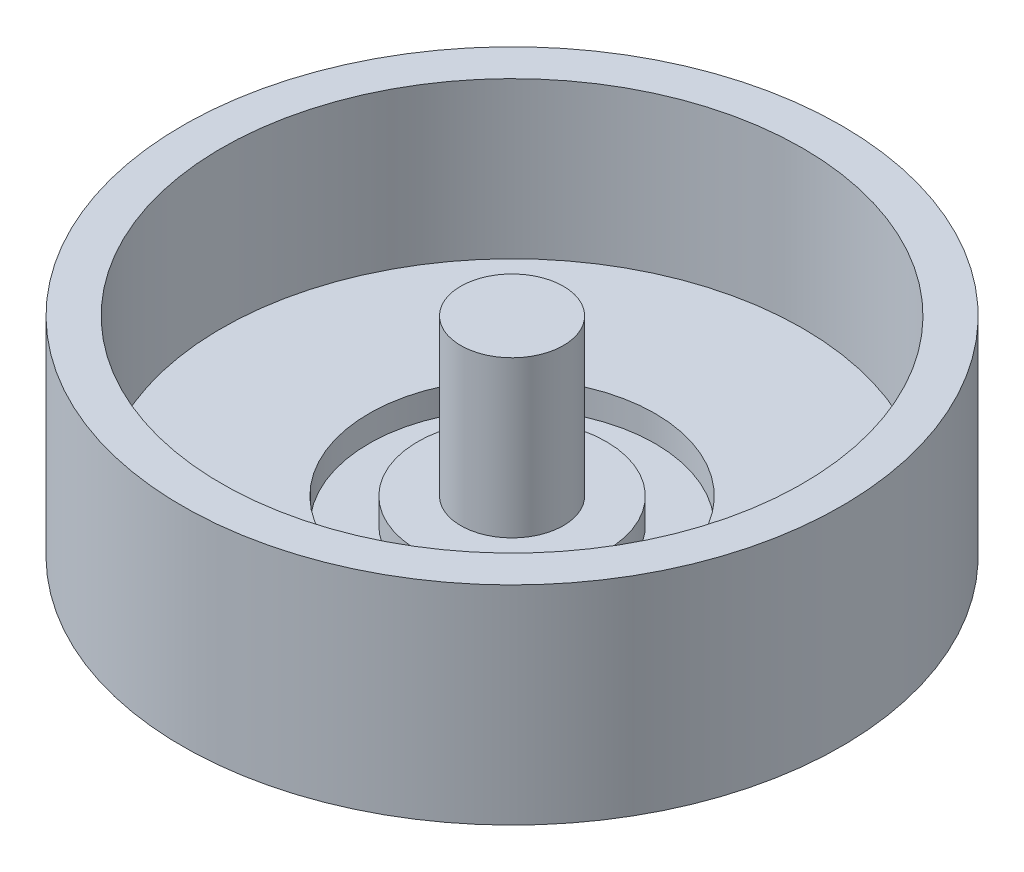
ISO-10303-21;
HEADER;
FILE_DESCRIPTION(('STEP AP214'),'2;1');
FILE_NAME('part.step','',(''),(''),'','','');
FILE_SCHEMA(('AUTOMOTIVE_DESIGN { 1 0 10303 214 1 1 1 1 }'));
ENDSEC;
DATA;
#1=APPLICATION_CONTEXT('core data for automotive mechanical design processes');
#2=APPLICATION_PROTOCOL_DEFINITION('international standard','automotive_design',2000,#1);
#3=PRODUCT_CONTEXT('',#1,'mechanical');
#4=PRODUCT('Part','Part','',(#3));
#5=PRODUCT_RELATED_PRODUCT_CATEGORY('part','',(#4));
#6=PRODUCT_DEFINITION_FORMATION('','',#4);
#7=PRODUCT_DEFINITION_CONTEXT('part definition',#1,'design');
#8=PRODUCT_DEFINITION('design','',#6,#7);
#9=PRODUCT_DEFINITION_SHAPE('','',#8);
#10=(LENGTH_UNIT() NAMED_UNIT(*) SI_UNIT(.MILLI.,.METRE.));
#11=(NAMED_UNIT(*) PLANE_ANGLE_UNIT() SI_UNIT($,.RADIAN.));
#12=(NAMED_UNIT(*) SI_UNIT($,.STERADIAN.) SOLID_ANGLE_UNIT());
#13=UNCERTAINTY_MEASURE_WITH_UNIT(LENGTH_MEASURE(1.E-05),#10,'distance_accuracy_value','');
#14=(GEOMETRIC_REPRESENTATION_CONTEXT(3) GLOBAL_UNCERTAINTY_ASSIGNED_CONTEXT((#13)) GLOBAL_UNIT_ASSIGNED_CONTEXT((#10,
#11,#12)) REPRESENTATION_CONTEXT('',''));
#15=CARTESIAN_POINT('',(0.,0.,0.));
#16=DIRECTION('',(0.,0.,1.));
#17=DIRECTION('',(1.,0.,0.));
#18=AXIS2_PLACEMENT_3D('',#15,#16,#17);
#19=CARTESIAN_POINT('',(0.,0.,-25.35));
#20=DIRECTION('',(0.,-1.,0.));
#21=DIRECTION('',(0.,0.,-1.));
#22=AXIS2_PLACEMENT_3D('',#19,#20,#21);
#23=PLANE('',#22);
#24=CARTESIAN_POINT('',(0.,0.,0.));
#25=DIRECTION('',(0.,-1.,0.));
#26=DIRECTION('',(0.,0.,-1.));
#27=AXIS2_PLACEMENT_3D('',#24,#25,#26);
#28=CIRCLE('',#27,25.35);
#29=CARTESIAN_POINT('',(0.,0.,-25.35));
#30=VERTEX_POINT('',#29);
#31=EDGE_CURVE('E69',#30,#30,#28,.T.);
#32=ORIENTED_EDGE('',*,*,#31,.T.);
#33=EDGE_LOOP('',(#32));
#34=FACE_BOUND('',#33,.T.);
#35=ADVANCED_FACE('F35',(#34),#23,.T.);
#36=CARTESIAN_POINT('',(0.,16.,0.));
#37=DIRECTION('',(0.,1.,0.));
#38=DIRECTION('',(0.,0.,1.));
#39=AXIS2_PLACEMENT_3D('',#36,#37,#38);
#40=PLANE('',#39);
#41=CARTESIAN_POINT('',(0.,16.,0.));
#42=DIRECTION('',(0.,-1.,0.));
#43=DIRECTION('',(0.,0.,-1.));
#44=AXIS2_PLACEMENT_3D('',#41,#42,#43);
#45=CIRCLE('',#44,3.95);
#46=CARTESIAN_POINT('',(0.,16.,-3.95));
#47=VERTEX_POINT('',#46);
#48=EDGE_CURVE('E10',#47,#47,#45,.T.);
#49=ORIENTED_EDGE('',*,*,#48,.F.);
#50=EDGE_LOOP('',(#49));
#51=FACE_BOUND('',#50,.T.);
#52=ADVANCED_FACE('F86',(#51),#40,.T.);
#53=CARTESIAN_POINT('',(0.,0.,0.));
#54=DIRECTION('',(0.,-1.,0.));
#55=DIRECTION('',(0.,0.,-1.));
#56=AXIS2_PLACEMENT_3D('',#53,#54,#55);
#57=CYLINDRICAL_SURFACE('',#56,3.95);
#58=ORIENTED_EDGE('',*,*,#48,.T.);
#59=EDGE_LOOP('',(#58));
#60=FACE_BOUND('',#59,.T.);
#61=CARTESIAN_POINT('',(0.,4.,0.));
#62=DIRECTION('',(0.,-1.,0.));
#63=DIRECTION('',(0.,0.,-1.));
#64=AXIS2_PLACEMENT_3D('',#61,#62,#63);
#65=CIRCLE('',#64,3.95);
#66=CARTESIAN_POINT('',(0.,4.,-3.95));
#67=VERTEX_POINT('',#66);
#68=EDGE_CURVE('E41',#67,#67,#65,.T.);
#69=ORIENTED_EDGE('',*,*,#68,.F.);
#70=EDGE_LOOP('',(#69));
#71=FACE_BOUND('',#70,.T.);
#72=ADVANCED_FACE('F90',(#60,#71),#57,.T.);
#73=CARTESIAN_POINT('',(0.,4.,-3.95));
#74=DIRECTION('',(0.,1.,0.));
#75=DIRECTION('',(0.,0.,1.));
#76=AXIS2_PLACEMENT_3D('',#73,#74,#75);
#77=PLANE('',#76);
#78=ORIENTED_EDGE('',*,*,#68,.T.);
#79=EDGE_LOOP('',(#78));
#80=FACE_BOUND('',#79,.T.);
#81=CARTESIAN_POINT('',(0.,4.,0.));
#82=DIRECTION('',(0.,-1.,0.));
#83=DIRECTION('',(0.,0.,-1.));
#84=AXIS2_PLACEMENT_3D('',#81,#82,#83);
#85=CIRCLE('',#84,7.25);
#86=CARTESIAN_POINT('',(0.,4.,-7.25));
#87=VERTEX_POINT('',#86);
#88=EDGE_CURVE('E45',#87,#87,#85,.T.);
#89=ORIENTED_EDGE('',*,*,#88,.F.);
#90=EDGE_LOOP('',(#89));
#91=FACE_BOUND('',#90,.T.);
#92=ADVANCED_FACE('F95',(#80,#91),#77,.T.);
#93=CARTESIAN_POINT('',(0.,0.,0.));
#94=DIRECTION('',(0.,-1.,0.));
#95=DIRECTION('',(0.,0.,-1.));
#96=AXIS2_PLACEMENT_3D('',#93,#94,#95);
#97=CYLINDRICAL_SURFACE('',#96,7.25);
#98=ORIENTED_EDGE('',*,*,#88,.T.);
#99=EDGE_LOOP('',(#98));
#100=FACE_BOUND('',#99,.T.);
#101=CARTESIAN_POINT('',(0.,2.,0.));
#102=DIRECTION('',(0.,-1.,0.));
#103=DIRECTION('',(0.,0.,-1.));
#104=AXIS2_PLACEMENT_3D('',#101,#102,#103);
#105=CIRCLE('',#104,7.25);
#106=CARTESIAN_POINT('',(0.,2.,-7.25));
#107=VERTEX_POINT('',#106);
#108=EDGE_CURVE('E49',#107,#107,#105,.T.);
#109=ORIENTED_EDGE('',*,*,#108,.F.);
#110=EDGE_LOOP('',(#109));
#111=FACE_BOUND('',#110,.T.);
#112=ADVANCED_FACE('F100',(#100,#111),#97,.T.);
#113=CARTESIAN_POINT('',(0.,2.,-7.25));
#114=DIRECTION('',(0.,1.,0.));
#115=DIRECTION('',(0.,0.,1.));
#116=AXIS2_PLACEMENT_3D('',#113,#114,#115);
#117=PLANE('',#116);
#118=ORIENTED_EDGE('',*,*,#108,.T.);
#119=EDGE_LOOP('',(#118));
#120=FACE_BOUND('',#119,.T.);
#121=CARTESIAN_POINT('',(0.,2.,0.));
#122=DIRECTION('',(0.,-1.,0.));
#123=DIRECTION('',(0.,0.,-1.));
#124=AXIS2_PLACEMENT_3D('',#121,#122,#123);
#125=CIRCLE('',#124,11.);
#126=CARTESIAN_POINT('',(0.,2.,-11.));
#127=VERTEX_POINT('',#126);
#128=EDGE_CURVE('E54',#127,#127,#125,.T.);
#129=ORIENTED_EDGE('',*,*,#128,.F.);
#130=EDGE_LOOP('',(#129));
#131=FACE_BOUND('',#130,.T.);
#132=ADVANCED_FACE('F103',(#120,#131),#117,.T.);
#133=CARTESIAN_POINT('',(0.,0.,0.));
#134=DIRECTION('',(0.,-1.,0.));
#135=DIRECTION('',(0.,0.,-1.));
#136=AXIS2_PLACEMENT_3D('',#133,#134,#135);
#137=CYLINDRICAL_SURFACE('',#136,11.);
#138=ORIENTED_EDGE('',*,*,#128,.T.);
#139=EDGE_LOOP('',(#138));
#140=FACE_BOUND('',#139,.T.);
#141=CARTESIAN_POINT('',(0.,4.,0.));
#142=DIRECTION('',(0.,-1.,0.));
#143=DIRECTION('',(0.,0.,-1.));
#144=AXIS2_PLACEMENT_3D('',#141,#142,#143);
#145=CIRCLE('',#144,11.);
#146=CARTESIAN_POINT('',(0.,4.,-11.));
#147=VERTEX_POINT('',#146);
#148=EDGE_CURVE('E57',#147,#147,#145,.T.);
#149=ORIENTED_EDGE('',*,*,#148,.F.);
#150=EDGE_LOOP('',(#149));
#151=FACE_BOUND('',#150,.T.);
#152=ADVANCED_FACE('F107',(#140,#151),#137,.F.);
#153=CARTESIAN_POINT('',(0.,4.,-11.));
#154=DIRECTION('',(0.,1.,0.));
#155=DIRECTION('',(0.,0.,1.));
#156=AXIS2_PLACEMENT_3D('',#153,#154,#155);
#157=PLANE('',#156);
#158=ORIENTED_EDGE('',*,*,#148,.T.);
#159=EDGE_LOOP('',(#158));
#160=FACE_BOUND('',#159,.T.);
#161=CARTESIAN_POINT('',(0.,4.,0.));
#162=DIRECTION('',(0.,-1.,0.));
#163=DIRECTION('',(0.,0.,-1.));
#164=AXIS2_PLACEMENT_3D('',#161,#162,#163);
#165=CIRCLE('',#164,22.35);
#166=CARTESIAN_POINT('',(0.,4.,-22.35));
#167=VERTEX_POINT('',#166);
#168=EDGE_CURVE('E60',#167,#167,#165,.T.);
#169=ORIENTED_EDGE('',*,*,#168,.F.);
#170=EDGE_LOOP('',(#169));
#171=FACE_BOUND('',#170,.T.);
#172=ADVANCED_FACE('F111',(#160,#171),#157,.T.);
#173=CARTESIAN_POINT('',(0.,0.,0.));
#174=DIRECTION('',(0.,-1.,0.));
#175=DIRECTION('',(0.,0.,-1.));
#176=AXIS2_PLACEMENT_3D('',#173,#174,#175);
#177=CYLINDRICAL_SURFACE('',#176,22.35);
#178=ORIENTED_EDGE('',*,*,#168,.T.);
#179=EDGE_LOOP('',(#178));
#180=FACE_BOUND('',#179,.T.);
#181=CARTESIAN_POINT('',(0.,16.,0.));
#182=DIRECTION('',(0.,-1.,0.));
#183=DIRECTION('',(0.,0.,-1.));
#184=AXIS2_PLACEMENT_3D('',#181,#182,#183);
#185=CIRCLE('',#184,22.35);
#186=CARTESIAN_POINT('',(0.,16.,-22.35));
#187=VERTEX_POINT('',#186);
#188=EDGE_CURVE('E63',#187,#187,#185,.T.);
#189=ORIENTED_EDGE('',*,*,#188,.F.);
#190=EDGE_LOOP('',(#189));
#191=FACE_BOUND('',#190,.T.);
#192=ADVANCED_FACE('F82',(#180,#191),#177,.F.);
#193=CARTESIAN_POINT('',(0.,16.,-22.35));
#194=DIRECTION('',(0.,1.,0.));
#195=DIRECTION('',(0.,0.,1.));
#196=AXIS2_PLACEMENT_3D('',#193,#194,#195);
#197=PLANE('',#196);
#198=ORIENTED_EDGE('',*,*,#188,.T.);
#199=EDGE_LOOP('',(#198));
#200=FACE_BOUND('',#199,.T.);
#201=CARTESIAN_POINT('',(0.,16.,0.));
#202=DIRECTION('',(0.,-1.,0.));
#203=DIRECTION('',(0.,0.,-1.));
#204=AXIS2_PLACEMENT_3D('',#201,#202,#203);
#205=CIRCLE('',#204,25.35);
#206=CARTESIAN_POINT('',(0.,16.,-25.35));
#207=VERTEX_POINT('',#206);
#208=EDGE_CURVE('E66',#207,#207,#205,.T.);
#209=ORIENTED_EDGE('',*,*,#208,.F.);
#210=EDGE_LOOP('',(#209));
#211=FACE_BOUND('',#210,.T.);
#212=ADVANCED_FACE('F76',(#200,#211),#197,.T.);
#213=CARTESIAN_POINT('',(0.,0.,0.));
#214=DIRECTION('',(0.,-1.,0.));
#215=DIRECTION('',(0.,0.,-1.));
#216=AXIS2_PLACEMENT_3D('',#213,#214,#215);
#217=CYLINDRICAL_SURFACE('',#216,25.35);
#218=ORIENTED_EDGE('',*,*,#208,.T.);
#219=EDGE_LOOP('',(#218));
#220=FACE_BOUND('',#219,.T.);
#221=ORIENTED_EDGE('',*,*,#31,.F.);
#222=EDGE_LOOP('',(#221));
#223=FACE_BOUND('',#222,.T.);
#224=ADVANCED_FACE('F74',(#220,#223),#217,.T.);
#225=CLOSED_SHELL('',(#35,#52,#72,#92,#112,#132,#152,#172,#192,#212,#224));
#226=MANIFOLD_SOLID_BREP('B2',#225);
#227=ADVANCED_BREP_SHAPE_REPRESENTATION('',(#18,#226),#14);
#228=SHAPE_DEFINITION_REPRESENTATION(#9,#227);
ENDSEC;
END-ISO-10303-21;
